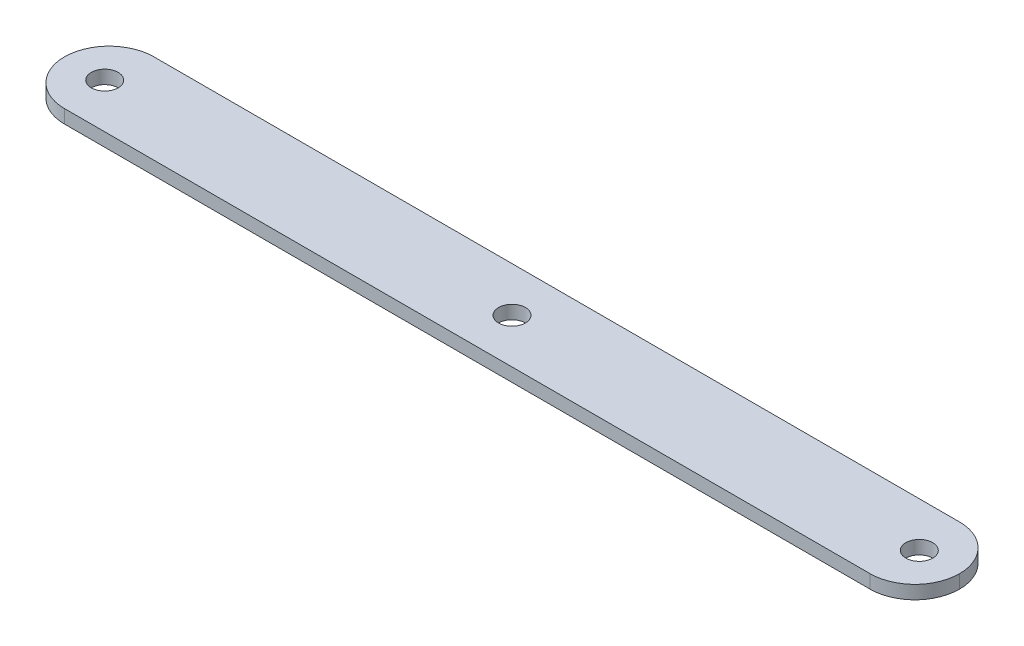
ISO-10303-21;
HEADER;
FILE_DESCRIPTION(('STEP AP214'),'2;1');
FILE_NAME('part.step','',(''),(''),'','','');
FILE_SCHEMA(('AUTOMOTIVE_DESIGN { 1 0 10303 214 1 1 1 1 }'));
ENDSEC;
DATA;
#1=APPLICATION_CONTEXT('core data for automotive mechanical design processes');
#2=APPLICATION_PROTOCOL_DEFINITION('international standard','automotive_design',2000,#1);
#3=PRODUCT_CONTEXT('',#1,'mechanical');
#4=PRODUCT('Part','Part','',(#3));
#5=PRODUCT_RELATED_PRODUCT_CATEGORY('part','',(#4));
#6=PRODUCT_DEFINITION_FORMATION('','',#4);
#7=PRODUCT_DEFINITION_CONTEXT('part definition',#1,'design');
#8=PRODUCT_DEFINITION('design','',#6,#7);
#9=PRODUCT_DEFINITION_SHAPE('','',#8);
#10=(LENGTH_UNIT() NAMED_UNIT(*) SI_UNIT(.MILLI.,.METRE.));
#11=(NAMED_UNIT(*) PLANE_ANGLE_UNIT() SI_UNIT($,.RADIAN.));
#12=(NAMED_UNIT(*) SI_UNIT($,.STERADIAN.) SOLID_ANGLE_UNIT());
#13=UNCERTAINTY_MEASURE_WITH_UNIT(LENGTH_MEASURE(1.E-05),#10,'distance_accuracy_value','');
#14=(GEOMETRIC_REPRESENTATION_CONTEXT(3) GLOBAL_UNCERTAINTY_ASSIGNED_CONTEXT((#13)) GLOBAL_UNIT_ASSIGNED_CONTEXT((#10,
#11,#12)) REPRESENTATION_CONTEXT('',''));
#15=CARTESIAN_POINT('',(0.,0.,0.));
#16=DIRECTION('',(0.,0.,1.));
#17=DIRECTION('',(1.,0.,0.));
#18=AXIS2_PLACEMENT_3D('',#15,#16,#17);
#19=CARTESIAN_POINT('',(0.,3.,0.));
#20=DIRECTION('',(0.,0.,-1.));
#21=DIRECTION('',(-1.,0.,0.));
#22=AXIS2_PLACEMENT_3D('',#19,#20,#21);
#23=PLANE('',#22);
#24=DIRECTION('',(1.,0.,0.));
#25=VECTOR('',#24,1.);
#26=CARTESIAN_POINT('',(0.,0.,0.));
#27=LINE('',#26,#25);
#28=CARTESIAN_POINT('',(10.,0.,0.));
#29=VERTEX_POINT('',#28);
#30=CARTESIAN_POINT('',(190.,0.,0.));
#31=VERTEX_POINT('',#30);
#32=EDGE_CURVE('E101',#29,#31,#27,.T.);
#33=ORIENTED_EDGE('',*,*,#32,.T.);
#34=DIRECTION('',(0.,-1.,0.));
#35=VECTOR('',#34,1.);
#36=CARTESIAN_POINT('',(190.,3.,0.));
#37=LINE('',#36,#35);
#38=CARTESIAN_POINT('',(190.,3.,0.));
#39=VERTEX_POINT('',#38);
#40=EDGE_CURVE('E12',#31,#39,#37,.F.);
#41=ORIENTED_EDGE('',*,*,#40,.T.);
#42=DIRECTION('',(1.,0.,0.));
#43=VECTOR('',#42,1.);
#44=CARTESIAN_POINT('',(0.,3.,0.));
#45=LINE('',#44,#43);
#46=CARTESIAN_POINT('',(10.,3.,0.));
#47=VERTEX_POINT('',#46);
#48=EDGE_CURVE('E143',#47,#39,#45,.T.);
#49=ORIENTED_EDGE('',*,*,#48,.F.);
#50=DIRECTION('',(0.,-1.,0.));
#51=VECTOR('',#50,1.);
#52=CARTESIAN_POINT('',(10.,3.,0.));
#53=LINE('',#52,#51);
#54=EDGE_CURVE('E125',#47,#29,#53,.T.);
#55=ORIENTED_EDGE('',*,*,#54,.T.);
#56=EDGE_LOOP('',(#33,#41,#49,#55));
#57=FACE_BOUND('',#56,.T.);
#58=ADVANCED_FACE('F39',(#57),#23,.F.);
#59=CARTESIAN_POINT('',(0.,3.,-20.));
#60=DIRECTION('',(0.,0.,1.));
#61=DIRECTION('',(1.,0.,0.));
#62=AXIS2_PLACEMENT_3D('',#59,#60,#61);
#63=PLANE('',#62);
#64=DIRECTION('',(-1.,0.,0.));
#65=VECTOR('',#64,1.);
#66=CARTESIAN_POINT('',(0.,3.,-20.));
#67=LINE('',#66,#65);
#68=CARTESIAN_POINT('',(190.,3.,-20.));
#69=VERTEX_POINT('',#68);
#70=CARTESIAN_POINT('',(10.,3.,-20.));
#71=VERTEX_POINT('',#70);
#72=EDGE_CURVE('E104',#69,#71,#67,.T.);
#73=ORIENTED_EDGE('',*,*,#72,.F.);
#74=DIRECTION('',(0.,-1.,0.));
#75=VECTOR('',#74,1.);
#76=CARTESIAN_POINT('',(190.,3.,-20.));
#77=LINE('',#76,#75);
#78=CARTESIAN_POINT('',(190.,0.,-20.));
#79=VERTEX_POINT('',#78);
#80=EDGE_CURVE('E126',#69,#79,#77,.T.);
#81=ORIENTED_EDGE('',*,*,#80,.T.);
#82=DIRECTION('',(-1.,0.,0.));
#83=VECTOR('',#82,1.);
#84=CARTESIAN_POINT('',(0.,0.,-20.));
#85=LINE('',#84,#83);
#86=CARTESIAN_POINT('',(10.,0.,-20.));
#87=VERTEX_POINT('',#86);
#88=EDGE_CURVE('E147',#79,#87,#85,.T.);
#89=ORIENTED_EDGE('',*,*,#88,.T.);
#90=DIRECTION('',(0.,-1.,0.));
#91=VECTOR('',#90,1.);
#92=CARTESIAN_POINT('',(10.,3.,-20.));
#93=LINE('',#92,#91);
#94=EDGE_CURVE('E117',#87,#71,#93,.F.);
#95=ORIENTED_EDGE('',*,*,#94,.T.);
#96=EDGE_LOOP('',(#73,#81,#89,#95));
#97=FACE_BOUND('',#96,.T.);
#98=ADVANCED_FACE('F142',(#97),#63,.F.);
#99=CARTESIAN_POINT('',(0.,3.,0.));
#100=DIRECTION('',(0.,-1.,0.));
#101=DIRECTION('',(0.,0.,-1.));
#102=AXIS2_PLACEMENT_3D('',#99,#100,#101);
#103=PLANE('',#102);
#104=CARTESIAN_POINT('',(100.,3.,-10.));
#105=DIRECTION('',(0.,1.,0.));
#106=DIRECTION('',(0.,0.,1.));
#107=AXIS2_PLACEMENT_3D('',#104,#105,#106);
#108=CIRCLE('',#107,3.00000000000001);
#109=CARTESIAN_POINT('',(100.,3.,-6.99999999999999));
#110=VERTEX_POINT('',#109);
#111=EDGE_CURVE('E151',#110,#110,#108,.T.);
#112=ORIENTED_EDGE('',*,*,#111,.F.);
#113=EDGE_LOOP('',(#112));
#114=FACE_BOUND('',#113,.T.);
#115=CARTESIAN_POINT('',(191.,3.,-10.));
#116=DIRECTION('',(0.,1.,0.));
#117=DIRECTION('',(0.,0.,1.));
#118=AXIS2_PLACEMENT_3D('',#115,#116,#117);
#119=CIRCLE('',#118,2.99999999999999);
#120=CARTESIAN_POINT('',(191.,3.,-7.00000000000001));
#121=VERTEX_POINT('',#120);
#122=EDGE_CURVE('E113',#121,#121,#119,.T.);
#123=ORIENTED_EDGE('',*,*,#122,.F.);
#124=EDGE_LOOP('',(#123));
#125=FACE_BOUND('',#124,.T.);
#126=CARTESIAN_POINT('',(9.,3.,-10.));
#127=DIRECTION('',(0.,1.,0.));
#128=DIRECTION('',(0.,0.,1.));
#129=AXIS2_PLACEMENT_3D('',#126,#127,#128);
#130=CIRCLE('',#129,3.);
#131=CARTESIAN_POINT('',(9.,3.,-7.));
#132=VERTEX_POINT('',#131);
#133=EDGE_CURVE('E170',#132,#132,#130,.T.);
#134=ORIENTED_EDGE('',*,*,#133,.F.);
#135=EDGE_LOOP('',(#134));
#136=FACE_BOUND('',#135,.T.);
#137=CARTESIAN_POINT('',(190.,3.,-10.));
#138=DIRECTION('',(0.,-1.,0.));
#139=DIRECTION('',(0.,0.,-1.));
#140=AXIS2_PLACEMENT_3D('',#137,#138,#139);
#141=CIRCLE('',#140,10.);
#142=CARTESIAN_POINT('',(200.,3.,-10.));
#143=VERTEX_POINT('',#142);
#144=EDGE_CURVE('E55',#39,#143,#141,.F.);
#145=ORIENTED_EDGE('',*,*,#144,.T.);
#146=CARTESIAN_POINT('',(190.,3.,-10.));
#147=DIRECTION('',(0.,-1.,0.));
#148=DIRECTION('',(0.,0.,-1.));
#149=AXIS2_PLACEMENT_3D('',#146,#147,#148);
#150=CIRCLE('',#149,10.);
#151=EDGE_CURVE('E48',#143,#69,#150,.F.);
#152=ORIENTED_EDGE('',*,*,#151,.T.);
#153=ORIENTED_EDGE('',*,*,#72,.T.);
#154=CARTESIAN_POINT('',(10.,3.,-10.));
#155=DIRECTION('',(0.,-1.,0.));
#156=DIRECTION('',(0.,0.,-1.));
#157=AXIS2_PLACEMENT_3D('',#154,#155,#156);
#158=CIRCLE('',#157,10.);
#159=CARTESIAN_POINT('',(0.,3.,-10.));
#160=VERTEX_POINT('',#159);
#161=EDGE_CURVE('E123',#71,#160,#158,.F.);
#162=ORIENTED_EDGE('',*,*,#161,.T.);
#163=CARTESIAN_POINT('',(10.,3.,-10.));
#164=DIRECTION('',(0.,-1.,0.));
#165=DIRECTION('',(0.,0.,-1.));
#166=AXIS2_PLACEMENT_3D('',#163,#164,#165);
#167=CIRCLE('',#166,10.);
#168=EDGE_CURVE('E110',#160,#47,#167,.F.);
#169=ORIENTED_EDGE('',*,*,#168,.T.);
#170=ORIENTED_EDGE('',*,*,#48,.T.);
#171=EDGE_LOOP('',(#145,#152,#153,#162,#169,#170));
#172=FACE_BOUND('',#171,.T.);
#173=ADVANCED_FACE('F137',(#114,#125,#136,#172),#103,.F.);
#174=CARTESIAN_POINT('',(0.,0.,0.));
#175=DIRECTION('',(0.,-1.,0.));
#176=DIRECTION('',(0.,0.,-1.));
#177=AXIS2_PLACEMENT_3D('',#174,#175,#176);
#178=PLANE('',#177);
#179=CARTESIAN_POINT('',(100.,0.,-10.));
#180=DIRECTION('',(0.,1.,0.));
#181=DIRECTION('',(0.,0.,1.));
#182=AXIS2_PLACEMENT_3D('',#179,#180,#181);
#183=CIRCLE('',#182,3.00000000000001);
#184=CARTESIAN_POINT('',(100.,0.,-6.99999999999999));
#185=VERTEX_POINT('',#184);
#186=EDGE_CURVE('E149',#185,#185,#183,.T.);
#187=ORIENTED_EDGE('',*,*,#186,.T.);
#188=EDGE_LOOP('',(#187));
#189=FACE_BOUND('',#188,.T.);
#190=CARTESIAN_POINT('',(191.,0.,-10.));
#191=DIRECTION('',(0.,1.,0.));
#192=DIRECTION('',(0.,0.,1.));
#193=AXIS2_PLACEMENT_3D('',#190,#191,#192);
#194=CIRCLE('',#193,2.99999999999999);
#195=CARTESIAN_POINT('',(191.,0.,-7.00000000000001));
#196=VERTEX_POINT('',#195);
#197=EDGE_CURVE('E159',#196,#196,#194,.T.);
#198=ORIENTED_EDGE('',*,*,#197,.T.);
#199=EDGE_LOOP('',(#198));
#200=FACE_BOUND('',#199,.T.);
#201=CARTESIAN_POINT('',(9.,0.,-10.));
#202=DIRECTION('',(0.,1.,0.));
#203=DIRECTION('',(0.,0.,1.));
#204=AXIS2_PLACEMENT_3D('',#201,#202,#203);
#205=CIRCLE('',#204,3.);
#206=CARTESIAN_POINT('',(9.,0.,-7.));
#207=VERTEX_POINT('',#206);
#208=EDGE_CURVE('E168',#207,#207,#205,.T.);
#209=ORIENTED_EDGE('',*,*,#208,.T.);
#210=EDGE_LOOP('',(#209));
#211=FACE_BOUND('',#210,.T.);
#212=ORIENTED_EDGE('',*,*,#88,.F.);
#213=CARTESIAN_POINT('',(190.,0.,-10.));
#214=DIRECTION('',(0.,-1.,0.));
#215=DIRECTION('',(0.,0.,-1.));
#216=AXIS2_PLACEMENT_3D('',#213,#214,#215);
#217=CIRCLE('',#216,10.);
#218=CARTESIAN_POINT('',(200.,0.,-10.));
#219=VERTEX_POINT('',#218);
#220=EDGE_CURVE('E132',#79,#219,#217,.T.);
#221=ORIENTED_EDGE('',*,*,#220,.T.);
#222=CARTESIAN_POINT('',(190.,0.,-10.));
#223=DIRECTION('',(0.,-1.,0.));
#224=DIRECTION('',(0.,0.,-1.));
#225=AXIS2_PLACEMENT_3D('',#222,#223,#224);
#226=CIRCLE('',#225,10.);
#227=EDGE_CURVE('E130',#219,#31,#226,.T.);
#228=ORIENTED_EDGE('',*,*,#227,.T.);
#229=ORIENTED_EDGE('',*,*,#32,.F.);
#230=CARTESIAN_POINT('',(10.,0.,-10.));
#231=DIRECTION('',(0.,-1.,0.));
#232=DIRECTION('',(0.,0.,-1.));
#233=AXIS2_PLACEMENT_3D('',#230,#231,#232);
#234=CIRCLE('',#233,10.);
#235=CARTESIAN_POINT('',(0.,0.,-10.));
#236=VERTEX_POINT('',#235);
#237=EDGE_CURVE('E94',#29,#236,#234,.T.);
#238=ORIENTED_EDGE('',*,*,#237,.T.);
#239=CARTESIAN_POINT('',(10.,0.,-10.));
#240=DIRECTION('',(0.,-1.,0.));
#241=DIRECTION('',(0.,0.,-1.));
#242=AXIS2_PLACEMENT_3D('',#239,#240,#241);
#243=CIRCLE('',#242,10.);
#244=EDGE_CURVE('E99',#236,#87,#243,.T.);
#245=ORIENTED_EDGE('',*,*,#244,.T.);
#246=EDGE_LOOP('',(#212,#221,#228,#229,#238,#245));
#247=FACE_BOUND('',#246,.T.);
#248=ADVANCED_FACE('F97',(#189,#200,#211,#247),#178,.T.);
#249=CARTESIAN_POINT('',(9.,0.,-10.));
#250=DIRECTION('',(0.,1.,0.));
#251=DIRECTION('',(0.,0.,1.));
#252=AXIS2_PLACEMENT_3D('',#249,#250,#251);
#253=CYLINDRICAL_SURFACE('',#252,3.);
#254=ORIENTED_EDGE('',*,*,#208,.F.);
#255=EDGE_LOOP('',(#254));
#256=FACE_BOUND('',#255,.T.);
#257=ORIENTED_EDGE('',*,*,#133,.T.);
#258=EDGE_LOOP('',(#257));
#259=FACE_BOUND('',#258,.T.);
#260=ADVANCED_FACE('F213',(#256,#259),#253,.F.);
#261=CARTESIAN_POINT('',(191.,0.,-10.));
#262=DIRECTION('',(0.,1.,0.));
#263=DIRECTION('',(0.,0.,1.));
#264=AXIS2_PLACEMENT_3D('',#261,#262,#263);
#265=CYLINDRICAL_SURFACE('',#264,2.99999999999999);
#266=ORIENTED_EDGE('',*,*,#197,.F.);
#267=EDGE_LOOP('',(#266));
#268=FACE_BOUND('',#267,.T.);
#269=ORIENTED_EDGE('',*,*,#122,.T.);
#270=EDGE_LOOP('',(#269));
#271=FACE_BOUND('',#270,.T.);
#272=ADVANCED_FACE('F187',(#268,#271),#265,.F.);
#273=CARTESIAN_POINT('',(10.,3.,-10.));
#274=DIRECTION('',(0.,-1.,0.));
#275=DIRECTION('',(0.,0.,-1.));
#276=AXIS2_PLACEMENT_3D('',#273,#274,#275);
#277=CYLINDRICAL_SURFACE('',#276,10.);
#278=ORIENTED_EDGE('',*,*,#54,.F.);
#279=ORIENTED_EDGE('',*,*,#168,.F.);
#280=DIRECTION('',(0.,-1.,0.));
#281=VECTOR('',#280,1.);
#282=CARTESIAN_POINT('',(0.,3.,-10.));
#283=LINE('',#282,#281);
#284=EDGE_CURVE('E108',#236,#160,#283,.F.);
#285=ORIENTED_EDGE('',*,*,#284,.F.);
#286=ORIENTED_EDGE('',*,*,#237,.F.);
#287=EDGE_LOOP('',(#278,#279,#285,#286));
#288=FACE_BOUND('',#287,.T.);
#289=ADVANCED_FACE('F109',(#288),#277,.T.);
#290=CARTESIAN_POINT('',(10.,3.,-10.));
#291=DIRECTION('',(0.,-1.,0.));
#292=DIRECTION('',(0.,0.,-1.));
#293=AXIS2_PLACEMENT_3D('',#290,#291,#292);
#294=CYLINDRICAL_SURFACE('',#293,10.);
#295=ORIENTED_EDGE('',*,*,#161,.F.);
#296=ORIENTED_EDGE('',*,*,#94,.F.);
#297=ORIENTED_EDGE('',*,*,#244,.F.);
#298=ORIENTED_EDGE('',*,*,#284,.T.);
#299=EDGE_LOOP('',(#295,#296,#297,#298));
#300=FACE_BOUND('',#299,.T.);
#301=ADVANCED_FACE('F115',(#300),#294,.T.);
#302=CARTESIAN_POINT('',(190.,3.,-10.));
#303=DIRECTION('',(0.,-1.,0.));
#304=DIRECTION('',(0.,0.,-1.));
#305=AXIS2_PLACEMENT_3D('',#302,#303,#304);
#306=CYLINDRICAL_SURFACE('',#305,10.);
#307=DIRECTION('',(0.,-1.,0.));
#308=VECTOR('',#307,1.);
#309=CARTESIAN_POINT('',(200.,3.,-10.));
#310=LINE('',#309,#308);
#311=EDGE_CURVE('E43',#143,#219,#310,.T.);
#312=ORIENTED_EDGE('',*,*,#311,.F.);
#313=ORIENTED_EDGE('',*,*,#144,.F.);
#314=ORIENTED_EDGE('',*,*,#40,.F.);
#315=ORIENTED_EDGE('',*,*,#227,.F.);
#316=EDGE_LOOP('',(#312,#313,#314,#315));
#317=FACE_BOUND('',#316,.T.);
#318=ADVANCED_FACE('F41',(#317),#306,.T.);
#319=CARTESIAN_POINT('',(190.,3.,-10.));
#320=DIRECTION('',(0.,-1.,0.));
#321=DIRECTION('',(0.,0.,-1.));
#322=AXIS2_PLACEMENT_3D('',#319,#320,#321);
#323=CYLINDRICAL_SURFACE('',#322,10.);
#324=ORIENTED_EDGE('',*,*,#151,.F.);
#325=ORIENTED_EDGE('',*,*,#311,.T.);
#326=ORIENTED_EDGE('',*,*,#220,.F.);
#327=ORIENTED_EDGE('',*,*,#80,.F.);
#328=EDGE_LOOP('',(#324,#325,#326,#327));
#329=FACE_BOUND('',#328,.T.);
#330=ADVANCED_FACE('F145',(#329),#323,.T.);
#331=CARTESIAN_POINT('',(100.,0.,-10.));
#332=DIRECTION('',(0.,1.,0.));
#333=DIRECTION('',(0.,0.,1.));
#334=AXIS2_PLACEMENT_3D('',#331,#332,#333);
#335=CYLINDRICAL_SURFACE('',#334,3.00000000000001);
#336=ORIENTED_EDGE('',*,*,#186,.F.);
#337=EDGE_LOOP('',(#336));
#338=FACE_BOUND('',#337,.T.);
#339=ORIENTED_EDGE('',*,*,#111,.T.);
#340=EDGE_LOOP('',(#339));
#341=FACE_BOUND('',#340,.T.);
#342=ADVANCED_FACE('F189',(#338,#341),#335,.F.);
#343=CLOSED_SHELL('',(#58,#98,#173,#248,#260,#272,#289,#301,#318,#330,#342));
#344=MANIFOLD_SOLID_BREP('B2',#343);
#345=ADVANCED_BREP_SHAPE_REPRESENTATION('',(#18,#344),#14);
#346=SHAPE_DEFINITION_REPRESENTATION(#9,#345);
ENDSEC;
END-ISO-10303-21;
